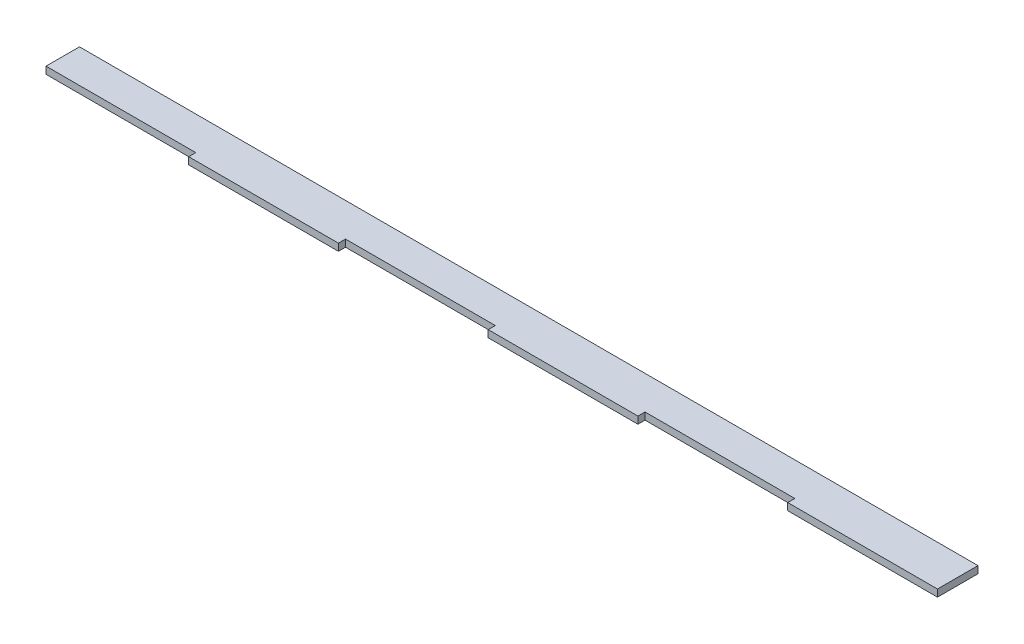
ISO-10303-21;
HEADER;
FILE_DESCRIPTION(('STEP AP214'),'2;1');
FILE_NAME('part.step','',(''),(''),'','','');
FILE_SCHEMA(('AUTOMOTIVE_DESIGN { 1 0 10303 214 1 1 1 1 }'));
ENDSEC;
DATA;
#1=APPLICATION_CONTEXT('core data for automotive mechanical design processes');
#2=APPLICATION_PROTOCOL_DEFINITION('international standard','automotive_design',2000,#1);
#3=PRODUCT_CONTEXT('',#1,'mechanical');
#4=PRODUCT('Part','Part','',(#3));
#5=PRODUCT_RELATED_PRODUCT_CATEGORY('part','',(#4));
#6=PRODUCT_DEFINITION_FORMATION('','',#4);
#7=PRODUCT_DEFINITION_CONTEXT('part definition',#1,'design');
#8=PRODUCT_DEFINITION('design','',#6,#7);
#9=PRODUCT_DEFINITION_SHAPE('','',#8);
#10=(LENGTH_UNIT() NAMED_UNIT(*) SI_UNIT(.MILLI.,.METRE.));
#11=(NAMED_UNIT(*) PLANE_ANGLE_UNIT() SI_UNIT($,.RADIAN.));
#12=(NAMED_UNIT(*) SI_UNIT($,.STERADIAN.) SOLID_ANGLE_UNIT());
#13=UNCERTAINTY_MEASURE_WITH_UNIT(LENGTH_MEASURE(1.E-05),#10,'distance_accuracy_value','');
#14=(GEOMETRIC_REPRESENTATION_CONTEXT(3) GLOBAL_UNCERTAINTY_ASSIGNED_CONTEXT((#13)) GLOBAL_UNIT_ASSIGNED_CONTEXT((#10,
#11,#12)) REPRESENTATION_CONTEXT('',''));
#15=CARTESIAN_POINT('',(0.,0.,0.));
#16=DIRECTION('',(0.,0.,1.));
#17=DIRECTION('',(1.,0.,0.));
#18=AXIS2_PLACEMENT_3D('',#15,#16,#17);
#19=CARTESIAN_POINT('',(0.,3.175,0.));
#20=DIRECTION('',(1.,0.,0.));
#21=DIRECTION('',(0.,0.,-1.));
#22=AXIS2_PLACEMENT_3D('',#19,#20,#21);
#23=PLANE('',#22);
#24=DIRECTION('',(0.,0.,1.));
#25=VECTOR('',#24,1.);
#26=CARTESIAN_POINT('',(0.,0.,0.));
#27=LINE('',#26,#25);
#28=CARTESIAN_POINT('',(0.,0.,-15.));
#29=VERTEX_POINT('',#28);
#30=CARTESIAN_POINT('',(0.,0.,0.));
#31=VERTEX_POINT('',#30);
#32=EDGE_CURVE('E275',#29,#31,#27,.T.);
#33=ORIENTED_EDGE('',*,*,#32,.T.);
#34=DIRECTION('',(0.,-1.,0.));
#35=VECTOR('',#34,1.);
#36=CARTESIAN_POINT('',(0.,3.175,0.));
#37=LINE('',#36,#35);
#38=CARTESIAN_POINT('',(0.,3.175,0.));
#39=VERTEX_POINT('',#38);
#40=EDGE_CURVE('E12',#39,#31,#37,.T.);
#41=ORIENTED_EDGE('',*,*,#40,.F.);
#42=DIRECTION('',(0.,0.,1.));
#43=VECTOR('',#42,1.);
#44=CARTESIAN_POINT('',(0.,3.175,0.));
#45=LINE('',#44,#43);
#46=CARTESIAN_POINT('',(0.,3.175,-15.));
#47=VERTEX_POINT('',#46);
#48=EDGE_CURVE('E223',#47,#39,#45,.T.);
#49=ORIENTED_EDGE('',*,*,#48,.F.);
#50=DIRECTION('',(0.,-1.,0.));
#51=VECTOR('',#50,1.);
#52=CARTESIAN_POINT('',(0.,3.175,-15.));
#53=LINE('',#52,#51);
#54=EDGE_CURVE('E169',#47,#29,#53,.T.);
#55=ORIENTED_EDGE('',*,*,#54,.T.);
#56=EDGE_LOOP('',(#33,#41,#49,#55));
#57=FACE_BOUND('',#56,.T.);
#58=ADVANCED_FACE('F38',(#57),#23,.F.);
#59=CARTESIAN_POINT('',(0.,3.175,0.));
#60=DIRECTION('',(0.,0.,-1.));
#61=DIRECTION('',(-1.,0.,0.));
#62=AXIS2_PLACEMENT_3D('',#59,#60,#61);
#63=PLANE('',#62);
#64=DIRECTION('',(1.,0.,0.));
#65=VECTOR('',#64,1.);
#66=CARTESIAN_POINT('',(0.,0.,0.));
#67=LINE('',#66,#65);
#68=CARTESIAN_POINT('',(67.14,0.,0.));
#69=VERTEX_POINT('',#68);
#70=EDGE_CURVE('E269',#31,#69,#67,.T.);
#71=ORIENTED_EDGE('',*,*,#70,.T.);
#72=DIRECTION('',(0.,-1.,0.));
#73=VECTOR('',#72,1.);
#74=CARTESIAN_POINT('',(67.14,3.175,0.));
#75=LINE('',#74,#73);
#76=CARTESIAN_POINT('',(67.14,3.175,0.));
#77=VERTEX_POINT('',#76);
#78=EDGE_CURVE('E46',#77,#69,#75,.T.);
#79=ORIENTED_EDGE('',*,*,#78,.F.);
#80=DIRECTION('',(1.,0.,0.));
#81=VECTOR('',#80,1.);
#82=CARTESIAN_POINT('',(0.,3.175,0.));
#83=LINE('',#82,#81);
#84=EDGE_CURVE('E114',#39,#77,#83,.T.);
#85=ORIENTED_EDGE('',*,*,#84,.F.);
#86=ORIENTED_EDGE('',*,*,#40,.T.);
#87=EDGE_LOOP('',(#71,#79,#85,#86));
#88=FACE_BOUND('',#87,.T.);
#89=ADVANCED_FACE('F308',(#88),#63,.F.);
#90=CARTESIAN_POINT('',(67.14,3.175,0.));
#91=DIRECTION('',(1.,0.,0.));
#92=DIRECTION('',(0.,0.,-1.));
#93=AXIS2_PLACEMENT_3D('',#90,#91,#92);
#94=PLANE('',#93);
#95=DIRECTION('',(0.,0.,1.));
#96=VECTOR('',#95,1.);
#97=CARTESIAN_POINT('',(67.14,0.,0.));
#98=LINE('',#97,#96);
#99=CARTESIAN_POINT('',(67.14,0.,3.175));
#100=VERTEX_POINT('',#99);
#101=EDGE_CURVE('E264',#69,#100,#98,.T.);
#102=ORIENTED_EDGE('',*,*,#101,.T.);
#103=DIRECTION('',(0.,-1.,0.));
#104=VECTOR('',#103,1.);
#105=CARTESIAN_POINT('',(67.14,3.175,3.175));
#106=LINE('',#105,#104);
#107=CARTESIAN_POINT('',(67.14,3.175,3.175));
#108=VERTEX_POINT('',#107);
#109=EDGE_CURVE('E256',#108,#100,#106,.T.);
#110=ORIENTED_EDGE('',*,*,#109,.F.);
#111=DIRECTION('',(0.,0.,1.));
#112=VECTOR('',#111,1.);
#113=CARTESIAN_POINT('',(67.14,3.175,0.));
#114=LINE('',#113,#112);
#115=EDGE_CURVE('E217',#77,#108,#114,.T.);
#116=ORIENTED_EDGE('',*,*,#115,.F.);
#117=ORIENTED_EDGE('',*,*,#78,.T.);
#118=EDGE_LOOP('',(#102,#110,#116,#117));
#119=FACE_BOUND('',#118,.T.);
#120=ADVANCED_FACE('F262',(#119),#94,.F.);
#121=CARTESIAN_POINT('',(67.14,3.175,3.175));
#122=DIRECTION('',(0.,0.,-1.));
#123=DIRECTION('',(-1.,0.,0.));
#124=AXIS2_PLACEMENT_3D('',#121,#122,#123);
#125=PLANE('',#124);
#126=DIRECTION('',(1.,0.,0.));
#127=VECTOR('',#126,1.);
#128=CARTESIAN_POINT('',(67.14,0.,3.175));
#129=LINE('',#128,#127);
#130=CARTESIAN_POINT('',(134.28,0.,3.175));
#131=VERTEX_POINT('',#130);
#132=EDGE_CURVE('E271',#100,#131,#129,.T.);
#133=ORIENTED_EDGE('',*,*,#132,.T.);
#134=DIRECTION('',(0.,-1.,0.));
#135=VECTOR('',#134,1.);
#136=CARTESIAN_POINT('',(134.28,3.175,3.175));
#137=LINE('',#136,#135);
#138=CARTESIAN_POINT('',(134.28,3.175,3.175));
#139=VERTEX_POINT('',#138);
#140=EDGE_CURVE('E253',#139,#131,#137,.T.);
#141=ORIENTED_EDGE('',*,*,#140,.F.);
#142=DIRECTION('',(1.,0.,0.));
#143=VECTOR('',#142,1.);
#144=CARTESIAN_POINT('',(67.14,3.175,3.175));
#145=LINE('',#144,#143);
#146=EDGE_CURVE('E209',#108,#139,#145,.T.);
#147=ORIENTED_EDGE('',*,*,#146,.F.);
#148=ORIENTED_EDGE('',*,*,#109,.T.);
#149=EDGE_LOOP('',(#133,#141,#147,#148));
#150=FACE_BOUND('',#149,.T.);
#151=ADVANCED_FACE('F315',(#150),#125,.F.);
#152=CARTESIAN_POINT('',(134.28,3.175,3.175));
#153=DIRECTION('',(-1.,0.,0.));
#154=DIRECTION('',(0.,0.,1.));
#155=AXIS2_PLACEMENT_3D('',#152,#153,#154);
#156=PLANE('',#155);
#157=DIRECTION('',(0.,0.,-1.));
#158=VECTOR('',#157,1.);
#159=CARTESIAN_POINT('',(134.28,0.,3.175));
#160=LINE('',#159,#158);
#161=CARTESIAN_POINT('',(134.28,0.,0.));
#162=VERTEX_POINT('',#161);
#163=EDGE_CURVE('E273',#131,#162,#160,.T.);
#164=ORIENTED_EDGE('',*,*,#163,.T.);
#165=DIRECTION('',(0.,-1.,0.));
#166=VECTOR('',#165,1.);
#167=CARTESIAN_POINT('',(134.28,3.175,0.));
#168=LINE('',#167,#166);
#169=CARTESIAN_POINT('',(134.28,3.175,0.));
#170=VERTEX_POINT('',#169);
#171=EDGE_CURVE('E250',#170,#162,#168,.T.);
#172=ORIENTED_EDGE('',*,*,#171,.F.);
#173=DIRECTION('',(0.,0.,-1.));
#174=VECTOR('',#173,1.);
#175=CARTESIAN_POINT('',(134.28,3.175,3.175));
#176=LINE('',#175,#174);
#177=EDGE_CURVE('E205',#139,#170,#176,.T.);
#178=ORIENTED_EDGE('',*,*,#177,.F.);
#179=ORIENTED_EDGE('',*,*,#140,.T.);
#180=EDGE_LOOP('',(#164,#172,#178,#179));
#181=FACE_BOUND('',#180,.T.);
#182=ADVANCED_FACE('F320',(#181),#156,.F.);
#183=CARTESIAN_POINT('',(134.28,3.175,0.));
#184=DIRECTION('',(0.,0.,-1.));
#185=DIRECTION('',(-1.,0.,0.));
#186=AXIS2_PLACEMENT_3D('',#183,#184,#185);
#187=PLANE('',#186);
#188=DIRECTION('',(1.,0.,0.));
#189=VECTOR('',#188,1.);
#190=CARTESIAN_POINT('',(134.28,0.,0.));
#191=LINE('',#190,#189);
#192=CARTESIAN_POINT('',(201.42,0.,0.));
#193=VERTEX_POINT('',#192);
#194=EDGE_CURVE('E279',#162,#193,#191,.T.);
#195=ORIENTED_EDGE('',*,*,#194,.T.);
#196=DIRECTION('',(0.,-1.,0.));
#197=VECTOR('',#196,1.);
#198=CARTESIAN_POINT('',(201.42,3.175,0.));
#199=LINE('',#198,#197);
#200=CARTESIAN_POINT('',(201.42,3.175,0.));
#201=VERTEX_POINT('',#200);
#202=EDGE_CURVE('E247',#201,#193,#199,.T.);
#203=ORIENTED_EDGE('',*,*,#202,.F.);
#204=DIRECTION('',(1.,0.,0.));
#205=VECTOR('',#204,1.);
#206=CARTESIAN_POINT('',(134.28,3.175,0.));
#207=LINE('',#206,#205);
#208=EDGE_CURVE('E201',#170,#201,#207,.T.);
#209=ORIENTED_EDGE('',*,*,#208,.F.);
#210=ORIENTED_EDGE('',*,*,#171,.T.);
#211=EDGE_LOOP('',(#195,#203,#209,#210));
#212=FACE_BOUND('',#211,.T.);
#213=ADVANCED_FACE('F324',(#212),#187,.F.);
#214=CARTESIAN_POINT('',(201.42,3.175,0.));
#215=DIRECTION('',(1.,0.,0.));
#216=DIRECTION('',(0.,0.,-1.));
#217=AXIS2_PLACEMENT_3D('',#214,#215,#216);
#218=PLANE('',#217);
#219=DIRECTION('',(0.,0.,1.));
#220=VECTOR('',#219,1.);
#221=CARTESIAN_POINT('',(201.42,0.,0.));
#222=LINE('',#221,#220);
#223=CARTESIAN_POINT('',(201.42,0.,3.175));
#224=VERTEX_POINT('',#223);
#225=EDGE_CURVE('E281',#193,#224,#222,.T.);
#226=ORIENTED_EDGE('',*,*,#225,.T.);
#227=DIRECTION('',(0.,-1.,0.));
#228=VECTOR('',#227,1.);
#229=CARTESIAN_POINT('',(201.42,3.175,3.175));
#230=LINE('',#229,#228);
#231=CARTESIAN_POINT('',(201.42,3.175,3.175));
#232=VERTEX_POINT('',#231);
#233=EDGE_CURVE('E244',#232,#224,#230,.T.);
#234=ORIENTED_EDGE('',*,*,#233,.F.);
#235=DIRECTION('',(0.,0.,1.));
#236=VECTOR('',#235,1.);
#237=CARTESIAN_POINT('',(201.42,3.175,0.));
#238=LINE('',#237,#236);
#239=EDGE_CURVE('E198',#201,#232,#238,.T.);
#240=ORIENTED_EDGE('',*,*,#239,.F.);
#241=ORIENTED_EDGE('',*,*,#202,.T.);
#242=EDGE_LOOP('',(#226,#234,#240,#241));
#243=FACE_BOUND('',#242,.T.);
#244=ADVANCED_FACE('F328',(#243),#218,.F.);
#245=CARTESIAN_POINT('',(201.42,3.175,3.175));
#246=DIRECTION('',(0.,0.,-1.));
#247=DIRECTION('',(-1.,0.,0.));
#248=AXIS2_PLACEMENT_3D('',#245,#246,#247);
#249=PLANE('',#248);
#250=DIRECTION('',(1.,0.,0.));
#251=VECTOR('',#250,1.);
#252=CARTESIAN_POINT('',(201.42,0.,3.175));
#253=LINE('',#252,#251);
#254=CARTESIAN_POINT('',(268.56,0.,3.175));
#255=VERTEX_POINT('',#254);
#256=EDGE_CURVE('E283',#224,#255,#253,.T.);
#257=ORIENTED_EDGE('',*,*,#256,.T.);
#258=DIRECTION('',(0.,-1.,0.));
#259=VECTOR('',#258,1.);
#260=CARTESIAN_POINT('',(268.56,3.175,3.175));
#261=LINE('',#260,#259);
#262=CARTESIAN_POINT('',(268.56,3.175,3.175));
#263=VERTEX_POINT('',#262);
#264=EDGE_CURVE('E241',#263,#255,#261,.T.);
#265=ORIENTED_EDGE('',*,*,#264,.F.);
#266=DIRECTION('',(1.,0.,0.));
#267=VECTOR('',#266,1.);
#268=CARTESIAN_POINT('',(201.42,3.175,3.175));
#269=LINE('',#268,#267);
#270=EDGE_CURVE('E190',#232,#263,#269,.T.);
#271=ORIENTED_EDGE('',*,*,#270,.F.);
#272=ORIENTED_EDGE('',*,*,#233,.T.);
#273=EDGE_LOOP('',(#257,#265,#271,#272));
#274=FACE_BOUND('',#273,.T.);
#275=ADVANCED_FACE('F332',(#274),#249,.F.);
#276=CARTESIAN_POINT('',(268.56,3.175,3.175));
#277=DIRECTION('',(-1.,0.,0.));
#278=DIRECTION('',(0.,0.,1.));
#279=AXIS2_PLACEMENT_3D('',#276,#277,#278);
#280=PLANE('',#279);
#281=DIRECTION('',(0.,0.,-1.));
#282=VECTOR('',#281,1.);
#283=CARTESIAN_POINT('',(268.56,0.,3.175));
#284=LINE('',#283,#282);
#285=CARTESIAN_POINT('',(268.56,0.,0.));
#286=VERTEX_POINT('',#285);
#287=EDGE_CURVE('E285',#255,#286,#284,.T.);
#288=ORIENTED_EDGE('',*,*,#287,.T.);
#289=DIRECTION('',(0.,-1.,0.));
#290=VECTOR('',#289,1.);
#291=CARTESIAN_POINT('',(268.56,3.175,0.));
#292=LINE('',#291,#290);
#293=CARTESIAN_POINT('',(268.56,3.175,0.));
#294=VERTEX_POINT('',#293);
#295=EDGE_CURVE('E238',#294,#286,#292,.T.);
#296=ORIENTED_EDGE('',*,*,#295,.F.);
#297=DIRECTION('',(0.,0.,-1.));
#298=VECTOR('',#297,1.);
#299=CARTESIAN_POINT('',(268.56,3.175,3.175));
#300=LINE('',#299,#298);
#301=EDGE_CURVE('E186',#263,#294,#300,.T.);
#302=ORIENTED_EDGE('',*,*,#301,.F.);
#303=ORIENTED_EDGE('',*,*,#264,.T.);
#304=EDGE_LOOP('',(#288,#296,#302,#303));
#305=FACE_BOUND('',#304,.T.);
#306=ADVANCED_FACE('F336',(#305),#280,.F.);
#307=CARTESIAN_POINT('',(268.56,3.175,0.));
#308=DIRECTION('',(0.,0.,-1.));
#309=DIRECTION('',(-1.,0.,0.));
#310=AXIS2_PLACEMENT_3D('',#307,#308,#309);
#311=PLANE('',#310);
#312=DIRECTION('',(1.,0.,0.));
#313=VECTOR('',#312,1.);
#314=CARTESIAN_POINT('',(268.56,0.,0.));
#315=LINE('',#314,#313);
#316=CARTESIAN_POINT('',(335.7,0.,0.));
#317=VERTEX_POINT('',#316);
#318=EDGE_CURVE('E287',#286,#317,#315,.T.);
#319=ORIENTED_EDGE('',*,*,#318,.T.);
#320=DIRECTION('',(0.,-1.,0.));
#321=VECTOR('',#320,1.);
#322=CARTESIAN_POINT('',(335.7,3.175,0.));
#323=LINE('',#322,#321);
#324=CARTESIAN_POINT('',(335.7,3.175,0.));
#325=VERTEX_POINT('',#324);
#326=EDGE_CURVE('E235',#325,#317,#323,.T.);
#327=ORIENTED_EDGE('',*,*,#326,.F.);
#328=DIRECTION('',(1.,0.,0.));
#329=VECTOR('',#328,1.);
#330=CARTESIAN_POINT('',(268.56,3.175,0.));
#331=LINE('',#330,#329);
#332=EDGE_CURVE('E182',#294,#325,#331,.T.);
#333=ORIENTED_EDGE('',*,*,#332,.F.);
#334=ORIENTED_EDGE('',*,*,#295,.T.);
#335=EDGE_LOOP('',(#319,#327,#333,#334));
#336=FACE_BOUND('',#335,.T.);
#337=ADVANCED_FACE('F340',(#336),#311,.F.);
#338=CARTESIAN_POINT('',(335.7,3.175,0.));
#339=DIRECTION('',(1.,0.,0.));
#340=DIRECTION('',(0.,0.,-1.));
#341=AXIS2_PLACEMENT_3D('',#338,#339,#340);
#342=PLANE('',#341);
#343=DIRECTION('',(0.,0.,1.));
#344=VECTOR('',#343,1.);
#345=CARTESIAN_POINT('',(335.7,0.,0.));
#346=LINE('',#345,#344);
#347=CARTESIAN_POINT('',(335.7,0.,3.175));
#348=VERTEX_POINT('',#347);
#349=EDGE_CURVE('E289',#317,#348,#346,.T.);
#350=ORIENTED_EDGE('',*,*,#349,.T.);
#351=DIRECTION('',(0.,-1.,0.));
#352=VECTOR('',#351,1.);
#353=CARTESIAN_POINT('',(335.7,3.175,3.175));
#354=LINE('',#353,#352);
#355=CARTESIAN_POINT('',(335.7,3.175,3.175));
#356=VERTEX_POINT('',#355);
#357=EDGE_CURVE('E162',#356,#348,#354,.T.);
#358=ORIENTED_EDGE('',*,*,#357,.F.);
#359=DIRECTION('',(0.,0.,1.));
#360=VECTOR('',#359,1.);
#361=CARTESIAN_POINT('',(335.7,3.175,0.));
#362=LINE('',#361,#360);
#363=EDGE_CURVE('E151',#325,#356,#362,.T.);
#364=ORIENTED_EDGE('',*,*,#363,.F.);
#365=ORIENTED_EDGE('',*,*,#326,.T.);
#366=EDGE_LOOP('',(#350,#358,#364,#365));
#367=FACE_BOUND('',#366,.T.);
#368=ADVANCED_FACE('F292',(#367),#342,.F.);
#369=CARTESIAN_POINT('',(335.7,3.175,3.175));
#370=DIRECTION('',(0.,0.,-1.));
#371=DIRECTION('',(-1.,0.,0.));
#372=AXIS2_PLACEMENT_3D('',#369,#370,#371);
#373=PLANE('',#372);
#374=DIRECTION('',(1.,0.,0.));
#375=VECTOR('',#374,1.);
#376=CARTESIAN_POINT('',(335.7,0.,3.175));
#377=LINE('',#376,#375);
#378=CARTESIAN_POINT('',(402.84,0.,3.175));
#379=VERTEX_POINT('',#378);
#380=EDGE_CURVE('E161',#348,#379,#377,.T.);
#381=ORIENTED_EDGE('',*,*,#380,.T.);
#382=DIRECTION('',(0.,-1.,0.));
#383=VECTOR('',#382,1.);
#384=CARTESIAN_POINT('',(402.84,3.175,3.175));
#385=LINE('',#384,#383);
#386=CARTESIAN_POINT('',(402.84,3.175,3.175));
#387=VERTEX_POINT('',#386);
#388=EDGE_CURVE('E158',#387,#379,#385,.T.);
#389=ORIENTED_EDGE('',*,*,#388,.F.);
#390=DIRECTION('',(1.,0.,0.));
#391=VECTOR('',#390,1.);
#392=CARTESIAN_POINT('',(335.7,3.175,3.175));
#393=LINE('',#392,#391);
#394=EDGE_CURVE('E145',#356,#387,#393,.T.);
#395=ORIENTED_EDGE('',*,*,#394,.F.);
#396=ORIENTED_EDGE('',*,*,#357,.T.);
#397=EDGE_LOOP('',(#381,#389,#395,#396));
#398=FACE_BOUND('',#397,.T.);
#399=ADVANCED_FACE('F159',(#398),#373,.F.);
#400=CARTESIAN_POINT('',(402.84,3.175,0.));
#401=DIRECTION('',(-1.,0.,0.));
#402=DIRECTION('',(0.,0.,1.));
#403=AXIS2_PLACEMENT_3D('',#400,#401,#402);
#404=PLANE('',#403);
#405=DIRECTION('',(0.,0.,-1.));
#406=VECTOR('',#405,1.);
#407=CARTESIAN_POINT('',(402.84,0.,0.));
#408=LINE('',#407,#406);
#409=CARTESIAN_POINT('',(402.84,0.,-15.));
#410=VERTEX_POINT('',#409);
#411=EDGE_CURVE('E100',#379,#410,#408,.T.);
#412=ORIENTED_EDGE('',*,*,#411,.T.);
#413=DIRECTION('',(0.,-1.,0.));
#414=VECTOR('',#413,1.);
#415=CARTESIAN_POINT('',(402.84,3.175,-15.));
#416=LINE('',#415,#414);
#417=CARTESIAN_POINT('',(402.84,3.175,-15.));
#418=VERTEX_POINT('',#417);
#419=EDGE_CURVE('E163',#418,#410,#416,.T.);
#420=ORIENTED_EDGE('',*,*,#419,.F.);
#421=DIRECTION('',(0.,0.,-1.));
#422=VECTOR('',#421,1.);
#423=CARTESIAN_POINT('',(402.84,3.175,3.175));
#424=LINE('',#423,#422);
#425=EDGE_CURVE('E149',#387,#418,#424,.T.);
#426=ORIENTED_EDGE('',*,*,#425,.F.);
#427=ORIENTED_EDGE('',*,*,#388,.T.);
#428=EDGE_LOOP('',(#412,#420,#426,#427));
#429=FACE_BOUND('',#428,.T.);
#430=ADVANCED_FACE('F165',(#429),#404,.F.);
#431=CARTESIAN_POINT('',(0.,3.175,-15.));
#432=DIRECTION('',(0.,0.,1.));
#433=DIRECTION('',(1.,0.,0.));
#434=AXIS2_PLACEMENT_3D('',#431,#432,#433);
#435=PLANE('',#434);
#436=DIRECTION('',(-1.,0.,0.));
#437=VECTOR('',#436,1.);
#438=CARTESIAN_POINT('',(0.,0.,-15.));
#439=LINE('',#438,#437);
#440=EDGE_CURVE('E106',#410,#29,#439,.T.);
#441=ORIENTED_EDGE('',*,*,#440,.T.);
#442=ORIENTED_EDGE('',*,*,#54,.F.);
#443=DIRECTION('',(-1.,0.,0.));
#444=VECTOR('',#443,1.);
#445=CARTESIAN_POINT('',(0.,3.175,-15.));
#446=LINE('',#445,#444);
#447=EDGE_CURVE('E54',#418,#47,#446,.T.);
#448=ORIENTED_EDGE('',*,*,#447,.F.);
#449=ORIENTED_EDGE('',*,*,#419,.T.);
#450=EDGE_LOOP('',(#441,#442,#448,#449));
#451=FACE_BOUND('',#450,.T.);
#452=ADVANCED_FACE('F297',(#451),#435,.F.);
#453=CARTESIAN_POINT('',(0.,3.175,0.));
#454=DIRECTION('',(0.,-1.,0.));
#455=DIRECTION('',(0.,0.,-1.));
#456=AXIS2_PLACEMENT_3D('',#453,#454,#455);
#457=PLANE('',#456);
#458=ORIENTED_EDGE('',*,*,#48,.T.);
#459=ORIENTED_EDGE('',*,*,#84,.T.);
#460=ORIENTED_EDGE('',*,*,#115,.T.);
#461=ORIENTED_EDGE('',*,*,#146,.T.);
#462=ORIENTED_EDGE('',*,*,#177,.T.);
#463=ORIENTED_EDGE('',*,*,#208,.T.);
#464=ORIENTED_EDGE('',*,*,#239,.T.);
#465=ORIENTED_EDGE('',*,*,#270,.T.);
#466=ORIENTED_EDGE('',*,*,#301,.T.);
#467=ORIENTED_EDGE('',*,*,#332,.T.);
#468=ORIENTED_EDGE('',*,*,#363,.T.);
#469=ORIENTED_EDGE('',*,*,#394,.T.);
#470=ORIENTED_EDGE('',*,*,#425,.T.);
#471=ORIENTED_EDGE('',*,*,#447,.T.);
#472=EDGE_LOOP('',(#458,#459,#460,#461,#462,#463,#464,#465,#466,#467,#468,#469,#470,#471));
#473=FACE_BOUND('',#472,.T.);
#474=ADVANCED_FACE('F147',(#473),#457,.F.);
#475=CARTESIAN_POINT('',(0.,0.,0.));
#476=DIRECTION('',(0.,-1.,0.));
#477=DIRECTION('',(0.,0.,-1.));
#478=AXIS2_PLACEMENT_3D('',#475,#476,#477);
#479=PLANE('',#478);
#480=ORIENTED_EDGE('',*,*,#32,.F.);
#481=ORIENTED_EDGE('',*,*,#440,.F.);
#482=ORIENTED_EDGE('',*,*,#411,.F.);
#483=ORIENTED_EDGE('',*,*,#380,.F.);
#484=ORIENTED_EDGE('',*,*,#349,.F.);
#485=ORIENTED_EDGE('',*,*,#318,.F.);
#486=ORIENTED_EDGE('',*,*,#287,.F.);
#487=ORIENTED_EDGE('',*,*,#256,.F.);
#488=ORIENTED_EDGE('',*,*,#225,.F.);
#489=ORIENTED_EDGE('',*,*,#194,.F.);
#490=ORIENTED_EDGE('',*,*,#163,.F.);
#491=ORIENTED_EDGE('',*,*,#132,.F.);
#492=ORIENTED_EDGE('',*,*,#101,.F.);
#493=ORIENTED_EDGE('',*,*,#70,.F.);
#494=EDGE_LOOP('',(#480,#481,#482,#483,#484,#485,#486,#487,#488,#489,#490,#491,#492,#493));
#495=FACE_BOUND('',#494,.T.);
#496=ADVANCED_FACE('F268',(#495),#479,.T.);
#497=CLOSED_SHELL('',(#58,#89,#120,#151,#182,#213,#244,#275,#306,#337,#368,#399,#430,#452,#474,#496));
#498=MANIFOLD_SOLID_BREP('B2',#497);
#499=ADVANCED_BREP_SHAPE_REPRESENTATION('',(#18,#498),#14);
#500=SHAPE_DEFINITION_REPRESENTATION(#9,#499);
ENDSEC;
END-ISO-10303-21;
